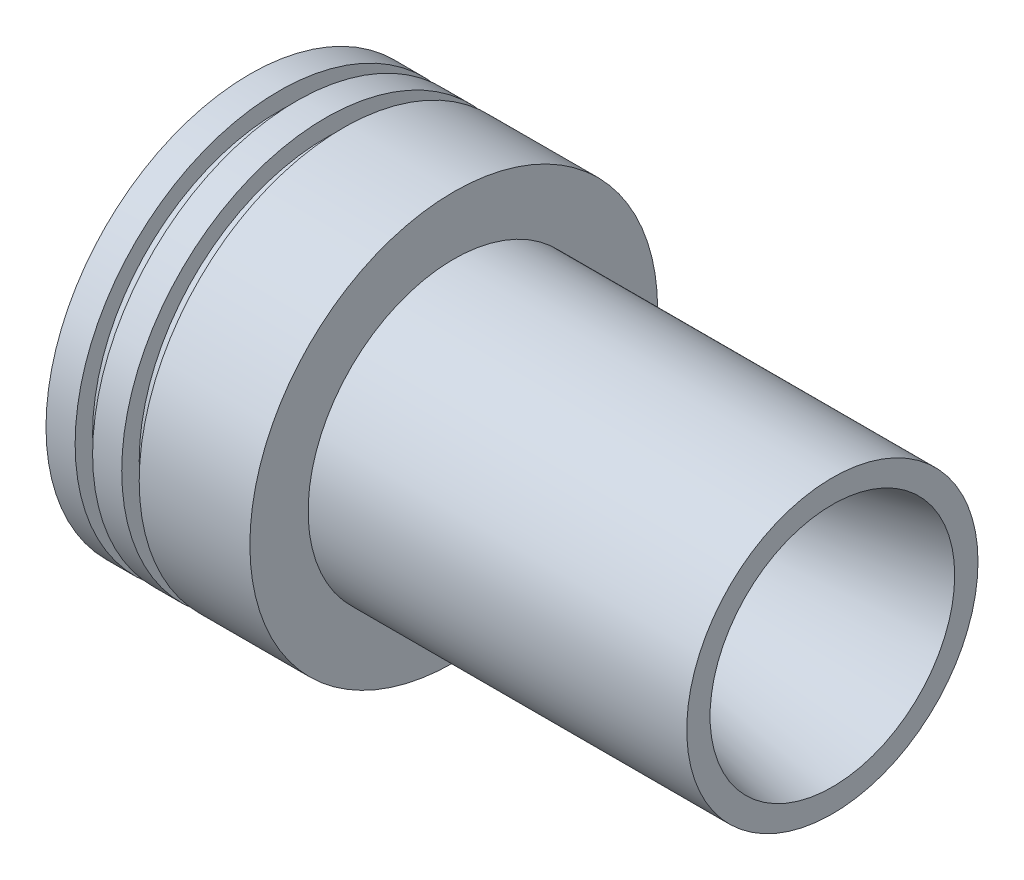
ISO-10303-21;
HEADER;
FILE_DESCRIPTION(('STEP AP214'),'2;1');
FILE_NAME('part.step','',(''),(''),'','','');
FILE_SCHEMA(('AUTOMOTIVE_DESIGN { 1 0 10303 214 1 1 1 1 }'));
ENDSEC;
DATA;
#1=APPLICATION_CONTEXT('core data for automotive mechanical design processes');
#2=APPLICATION_PROTOCOL_DEFINITION('international standard','automotive_design',2000,#1);
#3=PRODUCT_CONTEXT('',#1,'mechanical');
#4=PRODUCT('Part','Part','',(#3));
#5=PRODUCT_RELATED_PRODUCT_CATEGORY('part','',(#4));
#6=PRODUCT_DEFINITION_FORMATION('','',#4);
#7=PRODUCT_DEFINITION_CONTEXT('part definition',#1,'design');
#8=PRODUCT_DEFINITION('design','',#6,#7);
#9=PRODUCT_DEFINITION_SHAPE('','',#8);
#10=(LENGTH_UNIT() NAMED_UNIT(*) SI_UNIT(.MILLI.,.METRE.));
#11=(NAMED_UNIT(*) PLANE_ANGLE_UNIT() SI_UNIT($,.RADIAN.));
#12=(NAMED_UNIT(*) SI_UNIT($,.STERADIAN.) SOLID_ANGLE_UNIT());
#13=UNCERTAINTY_MEASURE_WITH_UNIT(LENGTH_MEASURE(1.E-05),#10,'distance_accuracy_value','');
#14=(GEOMETRIC_REPRESENTATION_CONTEXT(3) GLOBAL_UNCERTAINTY_ASSIGNED_CONTEXT((#13)) GLOBAL_UNIT_ASSIGNED_CONTEXT((#10,
#11,#12)) REPRESENTATION_CONTEXT('',''));
#15=CARTESIAN_POINT('',(0.,0.,0.));
#16=DIRECTION('',(0.,0.,1.));
#17=DIRECTION('',(1.,0.,0.));
#18=AXIS2_PLACEMENT_3D('',#15,#16,#17);
#19=CARTESIAN_POINT('',(35.,0.,0.));
#20=DIRECTION('',(-1.,0.,0.));
#21=DIRECTION('',(0.,0.,1.));
#22=AXIS2_PLACEMENT_3D('',#19,#20,#21);
#23=CYLINDRICAL_SURFACE('',#22,35.);
#24=CARTESIAN_POINT('',(35.,0.,0.));
#25=DIRECTION('',(1.,0.,0.));
#26=DIRECTION('',(0.,0.,-1.));
#27=AXIS2_PLACEMENT_3D('',#24,#25,#26);
#28=CIRCLE('',#27,35.);
#29=CARTESIAN_POINT('',(35.,0.,-35.));
#30=VERTEX_POINT('',#29);
#31=EDGE_CURVE('E49',#30,#30,#28,.T.);
#32=ORIENTED_EDGE('',*,*,#31,.F.);
#33=EDGE_LOOP('',(#32));
#34=FACE_BOUND('',#33,.T.);
#35=CARTESIAN_POINT('',(16.,0.,0.));
#36=DIRECTION('',(-1.,0.,0.));
#37=DIRECTION('',(0.,0.,1.));
#38=AXIS2_PLACEMENT_3D('',#35,#36,#37);
#39=CIRCLE('',#38,35.);
#40=CARTESIAN_POINT('',(16.,0.,35.));
#41=VERTEX_POINT('',#40);
#42=EDGE_CURVE('E73',#41,#41,#39,.T.);
#43=ORIENTED_EDGE('',*,*,#42,.F.);
#44=EDGE_LOOP('',(#43));
#45=FACE_BOUND('',#44,.T.);
#46=ADVANCED_FACE('F40',(#34,#45),#23,.T.);
#47=CARTESIAN_POINT('',(35.,0.,0.));
#48=DIRECTION('',(1.,0.,0.));
#49=DIRECTION('',(0.,0.,-1.));
#50=AXIS2_PLACEMENT_3D('',#47,#48,#49);
#51=PLANE('',#50);
#52=CARTESIAN_POINT('',(35.,0.,0.));
#53=DIRECTION('',(1.,0.,0.));
#54=DIRECTION('',(0.,0.,-1.));
#55=AXIS2_PLACEMENT_3D('',#52,#53,#54);
#56=CIRCLE('',#55,25.);
#57=CARTESIAN_POINT('',(35.,0.,-25.));
#58=VERTEX_POINT('',#57);
#59=EDGE_CURVE('E11',#58,#58,#56,.T.);
#60=ORIENTED_EDGE('',*,*,#59,.F.);
#61=EDGE_LOOP('',(#60));
#62=FACE_BOUND('',#61,.T.);
#63=ORIENTED_EDGE('',*,*,#31,.T.);
#64=EDGE_LOOP('',(#63));
#65=FACE_BOUND('',#64,.T.);
#66=ADVANCED_FACE('F84',(#62,#65),#51,.T.);
#67=CARTESIAN_POINT('',(100.,0.,0.));
#68=DIRECTION('',(-1.,0.,0.));
#69=DIRECTION('',(0.,0.,1.));
#70=AXIS2_PLACEMENT_3D('',#67,#68,#69);
#71=CYLINDRICAL_SURFACE('',#70,25.);
#72=CARTESIAN_POINT('',(100.,0.,0.));
#73=DIRECTION('',(1.,0.,0.));
#74=DIRECTION('',(0.,0.,-1.));
#75=AXIS2_PLACEMENT_3D('',#72,#73,#74);
#76=CIRCLE('',#75,25.);
#77=CARTESIAN_POINT('',(100.,0.,-25.));
#78=VERTEX_POINT('',#77);
#79=EDGE_CURVE('E59',#78,#78,#76,.T.);
#80=ORIENTED_EDGE('',*,*,#79,.F.);
#81=EDGE_LOOP('',(#80));
#82=FACE_BOUND('',#81,.T.);
#83=ORIENTED_EDGE('',*,*,#59,.T.);
#84=EDGE_LOOP('',(#83));
#85=FACE_BOUND('',#84,.T.);
#86=ADVANCED_FACE('F87',(#82,#85),#71,.T.);
#87=CARTESIAN_POINT('',(100.,0.,0.));
#88=DIRECTION('',(1.,0.,0.));
#89=DIRECTION('',(0.,0.,-1.));
#90=AXIS2_PLACEMENT_3D('',#87,#88,#89);
#91=PLANE('',#90);
#92=CARTESIAN_POINT('',(100.,0.,0.));
#93=DIRECTION('',(1.,0.,0.));
#94=DIRECTION('',(0.,0.,-1.));
#95=AXIS2_PLACEMENT_3D('',#92,#93,#94);
#96=CIRCLE('',#95,21.);
#97=CARTESIAN_POINT('',(100.,0.,-21.));
#98=VERTEX_POINT('',#97);
#99=EDGE_CURVE('E172',#98,#98,#96,.T.);
#100=ORIENTED_EDGE('',*,*,#99,.F.);
#101=EDGE_LOOP('',(#100));
#102=FACE_BOUND('',#101,.T.);
#103=ORIENTED_EDGE('',*,*,#79,.T.);
#104=EDGE_LOOP('',(#103));
#105=FACE_BOUND('',#104,.T.);
#106=ADVANCED_FACE('F91',(#102,#105),#91,.T.);
#107=CARTESIAN_POINT('',(31.8,0.,0.));
#108=DIRECTION('',(1.,0.,0.));
#109=DIRECTION('',(0.,0.,-1.));
#110=AXIS2_PLACEMENT_3D('',#107,#108,#109);
#111=CONICAL_SURFACE('',#110,6.5,0.209490609963191);
#112=ORIENTED_EDGE('',*,*,#99,.T.);
#113=EDGE_LOOP('',(#112));
#114=FACE_BOUND('',#113,.T.);
#115=CARTESIAN_POINT('',(31.8,0.,0.));
#116=DIRECTION('',(-1.,0.,0.));
#117=DIRECTION('',(0.,0.,-1.));
#118=AXIS2_PLACEMENT_3D('',#115,#116,#117);
#119=CIRCLE('',#118,6.5);
#120=CARTESIAN_POINT('',(31.8,0.,-6.5));
#121=VERTEX_POINT('',#120);
#122=EDGE_CURVE('E124',#121,#121,#119,.T.);
#123=ORIENTED_EDGE('',*,*,#122,.T.);
#124=EDGE_LOOP('',(#123));
#125=FACE_BOUND('',#124,.T.);
#126=ADVANCED_FACE('F95',(#114,#125),#111,.F.);
#127=CARTESIAN_POINT('',(13.,35.,0.));
#128=DIRECTION('',(1.,0.,0.));
#129=DIRECTION('',(0.,0.,-1.));
#130=AXIS2_PLACEMENT_3D('',#127,#128,#129);
#131=PLANE('',#130);
#132=CARTESIAN_POINT('',(13.,0.,0.));
#133=DIRECTION('',(-1.,0.,0.));
#134=DIRECTION('',(0.,0.,1.));
#135=AXIS2_PLACEMENT_3D('',#132,#133,#134);
#136=CIRCLE('',#135,32.);
#137=CARTESIAN_POINT('',(13.,0.,32.));
#138=VERTEX_POINT('',#137);
#139=EDGE_CURVE('E135',#138,#138,#136,.T.);
#140=ORIENTED_EDGE('',*,*,#139,.T.);
#141=EDGE_LOOP('',(#140));
#142=FACE_BOUND('',#141,.T.);
#143=CARTESIAN_POINT('',(13.,0.,0.));
#144=DIRECTION('',(-1.,0.,0.));
#145=DIRECTION('',(0.,0.,1.));
#146=AXIS2_PLACEMENT_3D('',#143,#144,#145);
#147=CIRCLE('',#146,35.);
#148=CARTESIAN_POINT('',(13.,0.,35.));
#149=VERTEX_POINT('',#148);
#150=EDGE_CURVE('E142',#149,#149,#147,.T.);
#151=ORIENTED_EDGE('',*,*,#150,.F.);
#152=EDGE_LOOP('',(#151));
#153=FACE_BOUND('',#152,.T.);
#154=ADVANCED_FACE('F243',(#142,#153),#131,.T.);
#155=CARTESIAN_POINT('',(0.,0.,0.));
#156=DIRECTION('',(-1.,0.,0.));
#157=DIRECTION('',(0.,0.,1.));
#158=AXIS2_PLACEMENT_3D('',#155,#156,#157);
#159=CYLINDRICAL_SURFACE('',#158,32.);
#160=CARTESIAN_POINT('',(16.,0.,0.));
#161=DIRECTION('',(-1.,0.,0.));
#162=DIRECTION('',(0.,0.,1.));
#163=AXIS2_PLACEMENT_3D('',#160,#161,#162);
#164=CIRCLE('',#163,32.);
#165=CARTESIAN_POINT('',(16.,0.,32.));
#166=VERTEX_POINT('',#165);
#167=EDGE_CURVE('E128',#166,#166,#164,.T.);
#168=ORIENTED_EDGE('',*,*,#167,.T.);
#169=EDGE_LOOP('',(#168));
#170=FACE_BOUND('',#169,.T.);
#171=ORIENTED_EDGE('',*,*,#139,.F.);
#172=EDGE_LOOP('',(#171));
#173=FACE_BOUND('',#172,.T.);
#174=ADVANCED_FACE('F221',(#170,#173),#159,.T.);
#175=CARTESIAN_POINT('',(16.,35.,0.));
#176=DIRECTION('',(-1.,0.,0.));
#177=DIRECTION('',(0.,0.,1.));
#178=AXIS2_PLACEMENT_3D('',#175,#176,#177);
#179=PLANE('',#178);
#180=ORIENTED_EDGE('',*,*,#167,.F.);
#181=EDGE_LOOP('',(#180));
#182=FACE_BOUND('',#181,.T.);
#183=ORIENTED_EDGE('',*,*,#42,.T.);
#184=EDGE_LOOP('',(#183));
#185=FACE_BOUND('',#184,.T.);
#186=ADVANCED_FACE('F201',(#182,#185),#179,.T.);
#187=ORIENTED_EDGE('',*,*,#150,.T.);
#188=EDGE_LOOP('',(#187));
#189=FACE_BOUND('',#188,.T.);
#190=CARTESIAN_POINT('',(8.,0.,0.));
#191=DIRECTION('',(-1.,0.,0.));
#192=DIRECTION('',(0.,0.,1.));
#193=AXIS2_PLACEMENT_3D('',#190,#191,#192);
#194=CIRCLE('',#193,35.);
#195=CARTESIAN_POINT('',(8.,0.,35.));
#196=VERTEX_POINT('',#195);
#197=EDGE_CURVE('E153',#196,#196,#194,.T.);
#198=ORIENTED_EDGE('',*,*,#197,.F.);
#199=EDGE_LOOP('',(#198));
#200=FACE_BOUND('',#199,.T.);
#201=ADVANCED_FACE('F205',(#189,#200),#23,.T.);
#202=CARTESIAN_POINT('',(5.,35.,0.));
#203=DIRECTION('',(1.,0.,0.));
#204=DIRECTION('',(0.,0.,-1.));
#205=AXIS2_PLACEMENT_3D('',#202,#203,#204);
#206=PLANE('',#205);
#207=CARTESIAN_POINT('',(5.,0.,0.));
#208=DIRECTION('',(-1.,0.,0.));
#209=DIRECTION('',(0.,0.,1.));
#210=AXIS2_PLACEMENT_3D('',#207,#208,#209);
#211=CIRCLE('',#210,32.);
#212=CARTESIAN_POINT('',(5.,0.,32.));
#213=VERTEX_POINT('',#212);
#214=EDGE_CURVE('E161',#213,#213,#211,.T.);
#215=ORIENTED_EDGE('',*,*,#214,.T.);
#216=EDGE_LOOP('',(#215));
#217=FACE_BOUND('',#216,.T.);
#218=CARTESIAN_POINT('',(5.,0.,0.));
#219=DIRECTION('',(-1.,0.,0.));
#220=DIRECTION('',(0.,0.,1.));
#221=AXIS2_PLACEMENT_3D('',#218,#219,#220);
#222=CIRCLE('',#221,35.);
#223=CARTESIAN_POINT('',(5.,0.,35.));
#224=VERTEX_POINT('',#223);
#225=EDGE_CURVE('E165',#224,#224,#222,.T.);
#226=ORIENTED_EDGE('',*,*,#225,.F.);
#227=EDGE_LOOP('',(#226));
#228=FACE_BOUND('',#227,.T.);
#229=ADVANCED_FACE('F213',(#217,#228),#206,.T.);
#230=CARTESIAN_POINT('',(0.,0.,0.));
#231=DIRECTION('',(-1.,0.,0.));
#232=DIRECTION('',(0.,0.,1.));
#233=AXIS2_PLACEMENT_3D('',#230,#231,#232);
#234=CYLINDRICAL_SURFACE('',#233,32.);
#235=CARTESIAN_POINT('',(8.,0.,0.));
#236=DIRECTION('',(-1.,0.,0.));
#237=DIRECTION('',(0.,0.,1.));
#238=AXIS2_PLACEMENT_3D('',#235,#236,#237);
#239=CIRCLE('',#238,32.);
#240=CARTESIAN_POINT('',(8.,0.,32.));
#241=VERTEX_POINT('',#240);
#242=EDGE_CURVE('E157',#241,#241,#239,.T.);
#243=ORIENTED_EDGE('',*,*,#242,.T.);
#244=EDGE_LOOP('',(#243));
#245=FACE_BOUND('',#244,.T.);
#246=ORIENTED_EDGE('',*,*,#214,.F.);
#247=EDGE_LOOP('',(#246));
#248=FACE_BOUND('',#247,.T.);
#249=ADVANCED_FACE('F219',(#245,#248),#234,.T.);
#250=CARTESIAN_POINT('',(8.,32.,0.));
#251=DIRECTION('',(-1.,0.,0.));
#252=DIRECTION('',(0.,0.,1.));
#253=AXIS2_PLACEMENT_3D('',#250,#251,#252);
#254=PLANE('',#253);
#255=ORIENTED_EDGE('',*,*,#197,.T.);
#256=EDGE_LOOP('',(#255));
#257=FACE_BOUND('',#256,.T.);
#258=ORIENTED_EDGE('',*,*,#242,.F.);
#259=EDGE_LOOP('',(#258));
#260=FACE_BOUND('',#259,.T.);
#261=ADVANCED_FACE('F100',(#257,#260),#254,.T.);
#262=CARTESIAN_POINT('',(30.8,0.,0.));
#263=DIRECTION('',(-1.,0.,0.));
#264=DIRECTION('',(0.,0.,1.));
#265=AXIS2_PLACEMENT_3D('',#262,#263,#264);
#266=CONICAL_SURFACE('',#265,6.5,0.564414893862454);
#267=CARTESIAN_POINT('',(0.,0.,0.));
#268=DIRECTION('',(-1.,0.,0.));
#269=DIRECTION('',(0.,0.,1.));
#270=AXIS2_PLACEMENT_3D('',#267,#268,#269);
#271=CIRCLE('',#270,26.);
#272=CARTESIAN_POINT('',(0.,0.,26.));
#273=VERTEX_POINT('',#272);
#274=EDGE_CURVE('E69',#273,#273,#271,.T.);
#275=ORIENTED_EDGE('',*,*,#274,.T.);
#276=EDGE_LOOP('',(#275));
#277=FACE_BOUND('',#276,.T.);
#278=CARTESIAN_POINT('',(30.8,0.,0.));
#279=DIRECTION('',(1.,0.,0.));
#280=DIRECTION('',(0.,0.,1.));
#281=AXIS2_PLACEMENT_3D('',#278,#279,#280);
#282=CIRCLE('',#281,6.5);
#283=CARTESIAN_POINT('',(30.8,0.,6.5));
#284=VERTEX_POINT('',#283);
#285=EDGE_CURVE('E120',#284,#284,#282,.T.);
#286=ORIENTED_EDGE('',*,*,#285,.T.);
#287=EDGE_LOOP('',(#286));
#288=FACE_BOUND('',#287,.T.);
#289=ADVANCED_FACE('F83',(#277,#288),#266,.F.);
#290=CARTESIAN_POINT('',(0.,0.,0.));
#291=DIRECTION('',(1.,0.,0.));
#292=DIRECTION('',(0.,0.,-1.));
#293=AXIS2_PLACEMENT_3D('',#290,#291,#292);
#294=PLANE('',#293);
#295=ORIENTED_EDGE('',*,*,#274,.F.);
#296=EDGE_LOOP('',(#295));
#297=FACE_BOUND('',#296,.T.);
#298=CARTESIAN_POINT('',(0.,0.,0.));
#299=DIRECTION('',(1.,0.,0.));
#300=DIRECTION('',(0.,0.,-1.));
#301=AXIS2_PLACEMENT_3D('',#298,#299,#300);
#302=CIRCLE('',#301,35.);
#303=CARTESIAN_POINT('',(0.,0.,-35.));
#304=VERTEX_POINT('',#303);
#305=EDGE_CURVE('E56',#304,#304,#302,.T.);
#306=ORIENTED_EDGE('',*,*,#305,.F.);
#307=EDGE_LOOP('',(#306));
#308=FACE_BOUND('',#307,.T.);
#309=ADVANCED_FACE('F74',(#297,#308),#294,.F.);
#310=ORIENTED_EDGE('',*,*,#305,.T.);
#311=EDGE_LOOP('',(#310));
#312=FACE_BOUND('',#311,.T.);
#313=ORIENTED_EDGE('',*,*,#225,.T.);
#314=EDGE_LOOP('',(#313));
#315=FACE_BOUND('',#314,.T.);
#316=ADVANCED_FACE('F42',(#312,#315),#23,.T.);
#317=CARTESIAN_POINT('',(100.,0.,0.));
#318=DIRECTION('',(-1.,0.,0.));
#319=DIRECTION('',(0.,0.,1.));
#320=AXIS2_PLACEMENT_3D('',#317,#318,#319);
#321=CYLINDRICAL_SURFACE('',#320,6.5);
#322=ORIENTED_EDGE('',*,*,#285,.F.);
#323=EDGE_LOOP('',(#322));
#324=FACE_BOUND('',#323,.T.);
#325=ORIENTED_EDGE('',*,*,#122,.F.);
#326=EDGE_LOOP('',(#325));
#327=FACE_BOUND('',#326,.T.);
#328=ADVANCED_FACE('F210',(#324,#327),#321,.F.);
#329=CLOSED_SHELL('',(#46,#66,#86,#106,#126,#154,#174,#186,#201,#229,#249,#261,#289,#309,#316,#328));
#330=MANIFOLD_SOLID_BREP('B2',#329);
#331=ADVANCED_BREP_SHAPE_REPRESENTATION('',(#18,#330),#14);
#332=SHAPE_DEFINITION_REPRESENTATION(#9,#331);
ENDSEC;
END-ISO-10303-21;
